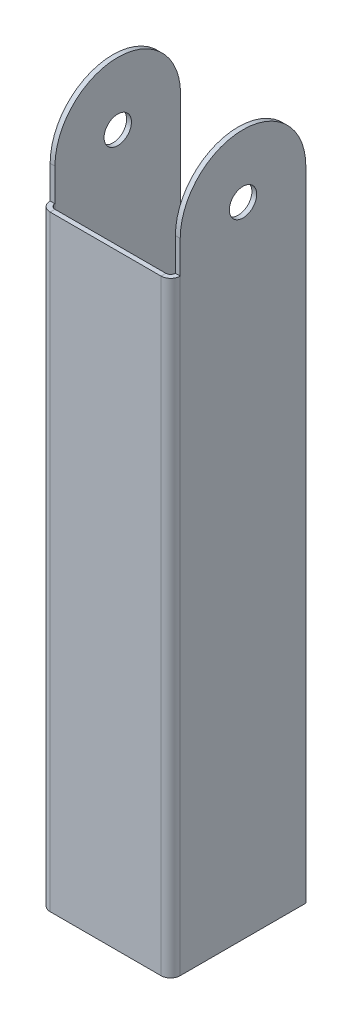
ISO-10303-21;
HEADER;
FILE_DESCRIPTION(('STEP AP214'),'2;1');
FILE_NAME('part.step','',(''),(''),'','','');
FILE_SCHEMA(('AUTOMOTIVE_DESIGN { 1 0 10303 214 1 1 1 1 }'));
ENDSEC;
DATA;
#1=APPLICATION_CONTEXT('core data for automotive mechanical design processes');
#2=APPLICATION_PROTOCOL_DEFINITION('international standard','automotive_design',2000,#1);
#3=PRODUCT_CONTEXT('',#1,'mechanical');
#4=PRODUCT('Part','Part','',(#3));
#5=PRODUCT_RELATED_PRODUCT_CATEGORY('part','',(#4));
#6=PRODUCT_DEFINITION_FORMATION('','',#4);
#7=PRODUCT_DEFINITION_CONTEXT('part definition',#1,'design');
#8=PRODUCT_DEFINITION('design','',#6,#7);
#9=PRODUCT_DEFINITION_SHAPE('','',#8);
#10=(LENGTH_UNIT() NAMED_UNIT(*) SI_UNIT(.MILLI.,.METRE.));
#11=(NAMED_UNIT(*) PLANE_ANGLE_UNIT() SI_UNIT($,.RADIAN.));
#12=(NAMED_UNIT(*) SI_UNIT($,.STERADIAN.) SOLID_ANGLE_UNIT());
#13=UNCERTAINTY_MEASURE_WITH_UNIT(LENGTH_MEASURE(1.E-05),#10,'distance_accuracy_value','');
#14=(GEOMETRIC_REPRESENTATION_CONTEXT(3) GLOBAL_UNCERTAINTY_ASSIGNED_CONTEXT((#13)) GLOBAL_UNIT_ASSIGNED_CONTEXT((#10,
#11,#12)) REPRESENTATION_CONTEXT('',''));
#15=CARTESIAN_POINT('',(0.,0.,0.));
#16=DIRECTION('',(0.,0.,1.));
#17=DIRECTION('',(1.,0.,0.));
#18=AXIS2_PLACEMENT_3D('',#15,#16,#17);
#19=CARTESIAN_POINT('',(-7.5,-46.4610389610389,-0.7366));
#20=DIRECTION('',(0.,-1.,0.));
#21=DIRECTION('',(0.,0.,-1.));
#22=AXIS2_PLACEMENT_3D('',#19,#20,#21);
#23=PLANE('',#22);
#24=DIRECTION('',(1.,0.,0.));
#25=VECTOR('',#24,1.);
#26=CARTESIAN_POINT('',(-7.5,-46.4610389610389,0.));
#27=LINE('',#26,#25);
#28=CARTESIAN_POINT('',(-8.5,-46.4610389610389,0.));
#29=VERTEX_POINT('',#28);
#30=CARTESIAN_POINT('',(8.5,-46.4610389610389,0.));
#31=VERTEX_POINT('',#30);
#32=EDGE_CURVE('E79',#29,#31,#27,.T.);
#33=ORIENTED_EDGE('',*,*,#32,.F.);
#34=DIRECTION('',(0.,0.,1.));
#35=VECTOR('',#34,1.);
#36=CARTESIAN_POINT('',(-8.5,-46.4610389610389,-0.7366));
#37=LINE('',#36,#35);
#38=CARTESIAN_POINT('',(-8.5,-46.4610389610389,-0.7366));
#39=VERTEX_POINT('',#38);
#40=EDGE_CURVE('E226',#39,#29,#37,.T.);
#41=ORIENTED_EDGE('',*,*,#40,.F.);
#42=DIRECTION('',(1.,0.,0.));
#43=VECTOR('',#42,1.);
#44=CARTESIAN_POINT('',(-7.5,-46.4610389610389,-0.7366));
#45=LINE('',#44,#43);
#46=CARTESIAN_POINT('',(8.5,-46.4610389610389,-0.736599999999997));
#47=VERTEX_POINT('',#46);
#48=EDGE_CURVE('E13',#39,#47,#45,.T.);
#49=ORIENTED_EDGE('',*,*,#48,.T.);
#50=DIRECTION('',(0.,0.,1.));
#51=VECTOR('',#50,1.);
#52=CARTESIAN_POINT('',(8.5,-46.4610389610389,-0.736599999999997));
#53=LINE('',#52,#51);
#54=EDGE_CURVE('E256',#47,#31,#53,.T.);
#55=ORIENTED_EDGE('',*,*,#54,.T.);
#56=EDGE_LOOP('',(#33,#41,#49,#55));
#57=FACE_BOUND('',#56,.T.);
#58=ADVANCED_FACE('F75',(#57),#23,.T.);
#59=CARTESIAN_POINT('',(-7.5,46.4610389610389,-0.7366));
#60=DIRECTION('',(0.,1.,0.));
#61=DIRECTION('',(0.,0.,1.));
#62=AXIS2_PLACEMENT_3D('',#59,#60,#61);
#63=PLANE('',#62);
#64=DIRECTION('',(-1.,0.,0.));
#65=VECTOR('',#64,1.);
#66=CARTESIAN_POINT('',(-7.5,46.4610389610389,0.));
#67=LINE('',#66,#65);
#68=CARTESIAN_POINT('',(8.5,46.4610389610389,0.));
#69=VERTEX_POINT('',#68);
#70=CARTESIAN_POINT('',(-8.5,46.4610389610389,0.));
#71=VERTEX_POINT('',#70);
#72=EDGE_CURVE('E268',#69,#71,#67,.T.);
#73=ORIENTED_EDGE('',*,*,#72,.F.);
#74=DIRECTION('',(0.,0.,1.));
#75=VECTOR('',#74,1.);
#76=CARTESIAN_POINT('',(8.5,46.4610389610389,-0.736599999999997));
#77=LINE('',#76,#75);
#78=CARTESIAN_POINT('',(8.5,46.4610389610389,-0.736599999999997));
#79=VERTEX_POINT('',#78);
#80=EDGE_CURVE('E266',#79,#69,#77,.T.);
#81=ORIENTED_EDGE('',*,*,#80,.F.);
#82=DIRECTION('',(-1.,0.,0.));
#83=VECTOR('',#82,1.);
#84=CARTESIAN_POINT('',(-7.5,46.4610389610389,-0.7366));
#85=LINE('',#84,#83);
#86=CARTESIAN_POINT('',(-8.5,46.4610389610389,-0.7366));
#87=VERTEX_POINT('',#86);
#88=EDGE_CURVE('E84',#79,#87,#85,.T.);
#89=ORIENTED_EDGE('',*,*,#88,.T.);
#90=DIRECTION('',(0.,0.,1.));
#91=VECTOR('',#90,1.);
#92=CARTESIAN_POINT('',(-8.5,46.4610389610389,-0.7366));
#93=LINE('',#92,#91);
#94=EDGE_CURVE('E216',#87,#71,#93,.T.);
#95=ORIENTED_EDGE('',*,*,#94,.T.);
#96=EDGE_LOOP('',(#73,#81,#89,#95));
#97=FACE_BOUND('',#96,.T.);
#98=ADVANCED_FACE('F77',(#97),#63,.T.);
#99=CARTESIAN_POINT('',(0.,0.,-0.7366));
#100=DIRECTION('',(0.,0.,-1.));
#101=DIRECTION('',(-1.,0.,0.));
#102=AXIS2_PLACEMENT_3D('',#99,#100,#101);
#103=PLANE('',#102);
#104=ORIENTED_EDGE('',*,*,#88,.F.);
#105=DIRECTION('',(0.,-1.,0.));
#106=VECTOR('',#105,1.);
#107=CARTESIAN_POINT('',(8.5,-46.4610389610389,-0.736599999999997));
#108=LINE('',#107,#106);
#109=EDGE_CURVE('E262',#47,#79,#108,.F.);
#110=ORIENTED_EDGE('',*,*,#109,.F.);
#111=ORIENTED_EDGE('',*,*,#48,.F.);
#112=DIRECTION('',(0.,1.,0.));
#113=VECTOR('',#112,1.);
#114=CARTESIAN_POINT('',(-8.5,46.4610389610389,-0.7366));
#115=LINE('',#114,#113);
#116=EDGE_CURVE('E217',#87,#39,#115,.F.);
#117=ORIENTED_EDGE('',*,*,#116,.F.);
#118=EDGE_LOOP('',(#104,#110,#111,#117));
#119=FACE_BOUND('',#118,.T.);
#120=ADVANCED_FACE('F389',(#119),#103,.T.);
#121=CARTESIAN_POINT('',(0.,0.,0.));
#122=DIRECTION('',(0.,0.,-1.));
#123=DIRECTION('',(-1.,0.,0.));
#124=AXIS2_PLACEMENT_3D('',#121,#122,#123);
#125=PLANE('',#124);
#126=ORIENTED_EDGE('',*,*,#32,.T.);
#127=DIRECTION('',(0.,-1.,0.));
#128=VECTOR('',#127,1.);
#129=CARTESIAN_POINT('',(8.5,-46.4610389610389,0.));
#130=LINE('',#129,#128);
#131=EDGE_CURVE('E251',#31,#69,#130,.F.);
#132=ORIENTED_EDGE('',*,*,#131,.T.);
#133=ORIENTED_EDGE('',*,*,#72,.T.);
#134=DIRECTION('',(0.,1.,0.));
#135=VECTOR('',#134,1.);
#136=CARTESIAN_POINT('',(-8.5,46.4610389610389,0.));
#137=LINE('',#136,#135);
#138=EDGE_CURVE('E278',#71,#29,#137,.F.);
#139=ORIENTED_EDGE('',*,*,#138,.T.);
#140=EDGE_LOOP('',(#126,#132,#133,#139));
#141=FACE_BOUND('',#140,.T.);
#142=ADVANCED_FACE('F277',(#141),#125,.F.);
#143=CARTESIAN_POINT('',(8.5,46.4610389610389,-1.4732));
#144=DIRECTION('',(0.,1.,0.));
#145=DIRECTION('',(0.,0.,1.));
#146=AXIS2_PLACEMENT_3D('',#143,#144,#145);
#147=PLANE('',#146);
#148=DIRECTION('',(-1.,0.,0.));
#149=VECTOR('',#148,1.);
#150=CARTESIAN_POINT('',(9.9732,46.4610389610389,-1.47319999999999));
#151=LINE('',#150,#149);
#152=CARTESIAN_POINT('',(9.2366,46.4610389610389,-1.47319999999999));
#153=VERTEX_POINT('',#152);
#154=CARTESIAN_POINT('',(9.9732,46.4610389610389,-1.47319999999999));
#155=VERTEX_POINT('',#154);
#156=EDGE_CURVE('E228',#153,#155,#151,.F.);
#157=ORIENTED_EDGE('',*,*,#156,.F.);
#158=CARTESIAN_POINT('',(8.5,46.4610389610389,-1.4732));
#159=DIRECTION('',(0.,-1.,0.));
#160=DIRECTION('',(0.,0.,-1.));
#161=AXIS2_PLACEMENT_3D('',#158,#159,#160);
#162=CIRCLE('',#161,0.7366);
#163=EDGE_CURVE('E259',#79,#153,#162,.F.);
#164=ORIENTED_EDGE('',*,*,#163,.F.);
#165=ORIENTED_EDGE('',*,*,#80,.T.);
#166=CARTESIAN_POINT('',(8.5,46.4610389610389,-1.4732));
#167=DIRECTION('',(0.,-1.,0.));
#168=DIRECTION('',(0.,0.,-1.));
#169=AXIS2_PLACEMENT_3D('',#166,#167,#168);
#170=CIRCLE('',#169,1.4732);
#171=EDGE_CURVE('E92',#69,#155,#170,.F.);
#172=ORIENTED_EDGE('',*,*,#171,.T.);
#173=EDGE_LOOP('',(#157,#164,#165,#172));
#174=FACE_BOUND('',#173,.T.);
#175=ADVANCED_FACE('F394',(#174),#147,.T.);
#176=CARTESIAN_POINT('',(8.5,-46.4610389610389,-1.4732));
#177=DIRECTION('',(0.,1.,0.));
#178=DIRECTION('',(0.,0.,1.));
#179=AXIS2_PLACEMENT_3D('',#176,#177,#178);
#180=PLANE('',#179);
#181=CARTESIAN_POINT('',(8.5,-46.4610389610389,-1.4732));
#182=DIRECTION('',(0.,-1.,0.));
#183=DIRECTION('',(0.,0.,-1.));
#184=AXIS2_PLACEMENT_3D('',#181,#182,#183);
#185=CIRCLE('',#184,0.7366);
#186=CARTESIAN_POINT('',(9.2366,-46.4610389610389,-1.47319999999999));
#187=VERTEX_POINT('',#186);
#188=EDGE_CURVE('E233',#187,#47,#185,.T.);
#189=ORIENTED_EDGE('',*,*,#188,.F.);
#190=DIRECTION('',(-1.,0.,0.));
#191=VECTOR('',#190,1.);
#192=CARTESIAN_POINT('',(9.2366,-46.4610389610389,-1.47319999999999));
#193=LINE('',#192,#191);
#194=CARTESIAN_POINT('',(9.9732,-46.4610389610389,-1.47319999999999));
#195=VERTEX_POINT('',#194);
#196=EDGE_CURVE('E244',#187,#195,#193,.F.);
#197=ORIENTED_EDGE('',*,*,#196,.T.);
#198=CARTESIAN_POINT('',(8.5,-46.4610389610389,-1.4732));
#199=DIRECTION('',(0.,-1.,0.));
#200=DIRECTION('',(0.,0.,-1.));
#201=AXIS2_PLACEMENT_3D('',#198,#199,#200);
#202=CIRCLE('',#201,1.4732);
#203=EDGE_CURVE('E254',#195,#31,#202,.T.);
#204=ORIENTED_EDGE('',*,*,#203,.T.);
#205=ORIENTED_EDGE('',*,*,#54,.F.);
#206=EDGE_LOOP('',(#189,#197,#204,#205));
#207=FACE_BOUND('',#206,.T.);
#208=ADVANCED_FACE('F285',(#207),#180,.F.);
#209=CARTESIAN_POINT('',(8.5,-46.4610389610389,-1.4732));
#210=DIRECTION('',(0.,-1.,0.));
#211=DIRECTION('',(1.,0.,0.));
#212=AXIS2_PLACEMENT_3D('',#209,#210,#211);
#213=CYLINDRICAL_SURFACE('',#212,1.4732);
#214=ORIENTED_EDGE('',*,*,#131,.F.);
#215=ORIENTED_EDGE('',*,*,#203,.F.);
#216=DIRECTION('',(0.,-1.,0.));
#217=VECTOR('',#216,1.);
#218=CARTESIAN_POINT('',(9.9732,46.4610389610389,-1.47319999999999));
#219=LINE('',#218,#217);
#220=EDGE_CURVE('E242',#195,#155,#219,.F.);
#221=ORIENTED_EDGE('',*,*,#220,.T.);
#222=ORIENTED_EDGE('',*,*,#171,.F.);
#223=EDGE_LOOP('',(#214,#215,#221,#222));
#224=FACE_BOUND('',#223,.T.);
#225=ADVANCED_FACE('F400',(#224),#213,.T.);
#226=CARTESIAN_POINT('',(8.5,-46.4610389610389,-1.4732));
#227=DIRECTION('',(0.,-1.,0.));
#228=DIRECTION('',(1.,0.,0.));
#229=AXIS2_PLACEMENT_3D('',#226,#227,#228);
#230=CYLINDRICAL_SURFACE('',#229,0.7366);
#231=ORIENTED_EDGE('',*,*,#109,.T.);
#232=ORIENTED_EDGE('',*,*,#163,.T.);
#233=DIRECTION('',(0.,-1.,0.));
#234=VECTOR('',#233,1.);
#235=CARTESIAN_POINT('',(9.2366,46.4610389610389,-1.4732));
#236=LINE('',#235,#234);
#237=EDGE_CURVE('E247',#153,#187,#236,.T.);
#238=ORIENTED_EDGE('',*,*,#237,.T.);
#239=ORIENTED_EDGE('',*,*,#188,.T.);
#240=EDGE_LOOP('',(#231,#232,#238,#239));
#241=FACE_BOUND('',#240,.T.);
#242=ADVANCED_FACE('F288',(#241),#230,.F.);
#243=CARTESIAN_POINT('',(9.97320000000007,-46.4610389610389,-20.7366));
#244=DIRECTION('',(0.,1.,0.));
#245=DIRECTION('',(0.,0.,1.));
#246=AXIS2_PLACEMENT_3D('',#243,#244,#245);
#247=PLANE('',#246);
#248=ORIENTED_EDGE('',*,*,#196,.F.);
#249=DIRECTION('',(0.,0.,1.));
#250=VECTOR('',#249,1.);
#251=CARTESIAN_POINT('',(9.23660000000007,-46.4610389610389,-20.7366));
#252=LINE('',#251,#250);
#253=CARTESIAN_POINT('',(9.23660000000007,-46.4610389610389,-20.7366));
#254=VERTEX_POINT('',#253);
#255=EDGE_CURVE('E240',#187,#254,#252,.F.);
#256=ORIENTED_EDGE('',*,*,#255,.T.);
#257=DIRECTION('',(-1.,0.,0.));
#258=VECTOR('',#257,1.);
#259=CARTESIAN_POINT('',(9.97320000000007,-46.4610389610389,-20.7366));
#260=LINE('',#259,#258);
#261=CARTESIAN_POINT('',(9.97320000000007,-46.4610389610389,-20.7366));
#262=VERTEX_POINT('',#261);
#263=EDGE_CURVE('E230',#262,#254,#260,.T.);
#264=ORIENTED_EDGE('',*,*,#263,.F.);
#265=DIRECTION('',(0.,0.,-1.));
#266=VECTOR('',#265,1.);
#267=CARTESIAN_POINT('',(9.97319999999999,-46.4610389610389,0.));
#268=LINE('',#267,#266);
#269=EDGE_CURVE('E236',#195,#262,#268,.T.);
#270=ORIENTED_EDGE('',*,*,#269,.F.);
#271=EDGE_LOOP('',(#248,#256,#264,#270));
#272=FACE_BOUND('',#271,.T.);
#273=ADVANCED_FACE('F372',(#272),#247,.F.);
#274=CARTESIAN_POINT('',(9.97319999999999,0.,0.));
#275=DIRECTION('',(-1.,0.,0.));
#276=DIRECTION('',(0.,0.,1.));
#277=AXIS2_PLACEMENT_3D('',#274,#275,#276);
#278=PLANE('',#277);
#279=ORIENTED_EDGE('',*,*,#220,.F.);
#280=ORIENTED_EDGE('',*,*,#269,.T.);
#281=DIRECTION('',(0.,1.,0.));
#282=VECTOR('',#281,1.);
#283=CARTESIAN_POINT('',(9.97320000000007,0.,-20.7366));
#284=LINE('',#283,#282);
#285=CARTESIAN_POINT('',(9.97320000000007,51.4610389610389,-20.7366));
#286=VERTEX_POINT('',#285);
#287=EDGE_CURVE('E234',#262,#286,#284,.T.);
#288=ORIENTED_EDGE('',*,*,#287,.T.);
#289=CARTESIAN_POINT('',(9.97320000000003,51.4610389610389,-11.1049));
#290=DIRECTION('',(1.,0.,0.));
#291=DIRECTION('',(0.,0.,1.));
#292=AXIS2_PLACEMENT_3D('',#289,#290,#291);
#293=CIRCLE('',#292,9.6317);
#294=CARTESIAN_POINT('',(9.9732,51.4610389610389,-1.47319999999999));
#295=VERTEX_POINT('',#294);
#296=EDGE_CURVE('E315',#286,#295,#293,.T.);
#297=ORIENTED_EDGE('',*,*,#296,.T.);
#298=DIRECTION('',(0.,-1.,0.));
#299=VECTOR('',#298,1.);
#300=CARTESIAN_POINT('',(9.9732,46.4610389610389,-1.47319999999999));
#301=LINE('',#300,#299);
#302=EDGE_CURVE('E311',#295,#155,#301,.T.);
#303=ORIENTED_EDGE('',*,*,#302,.T.);
#304=EDGE_LOOP('',(#279,#280,#288,#297,#303));
#305=FACE_BOUND('',#304,.T.);
#306=CARTESIAN_POINT('',(9.97320000000003,51.4610389610389,-11.1049));
#307=DIRECTION('',(1.,0.,0.));
#308=DIRECTION('',(0.,0.,-1.));
#309=AXIS2_PLACEMENT_3D('',#306,#307,#308);
#310=CIRCLE('',#309,2.1);
#311=CARTESIAN_POINT('',(9.97320000000004,51.4610389610389,-13.2049));
#312=VERTEX_POINT('',#311);
#313=EDGE_CURVE('E353',#312,#312,#310,.T.);
#314=ORIENTED_EDGE('',*,*,#313,.F.);
#315=EDGE_LOOP('',(#314));
#316=FACE_BOUND('',#315,.T.);
#317=ADVANCED_FACE('F370',(#305,#316),#278,.F.);
#318=CARTESIAN_POINT('',(9.23659999999999,0.,0.));
#319=DIRECTION('',(-1.,0.,0.));
#320=DIRECTION('',(0.,0.,1.));
#321=AXIS2_PLACEMENT_3D('',#318,#319,#320);
#322=PLANE('',#321);
#323=ORIENTED_EDGE('',*,*,#255,.F.);
#324=ORIENTED_EDGE('',*,*,#237,.F.);
#325=DIRECTION('',(0.,-1.,0.));
#326=VECTOR('',#325,1.);
#327=CARTESIAN_POINT('',(9.2366,46.4610389610389,-1.47319999999999));
#328=LINE('',#327,#326);
#329=CARTESIAN_POINT('',(9.2366,51.4610389610389,-1.47319999999999));
#330=VERTEX_POINT('',#329);
#331=EDGE_CURVE('E298',#330,#153,#328,.T.);
#332=ORIENTED_EDGE('',*,*,#331,.F.);
#333=CARTESIAN_POINT('',(9.23660000000003,51.4610389610389,-11.1049));
#334=DIRECTION('',(1.,0.,0.));
#335=DIRECTION('',(0.,0.,1.));
#336=AXIS2_PLACEMENT_3D('',#333,#334,#335);
#337=CIRCLE('',#336,9.6317);
#338=CARTESIAN_POINT('',(9.23660000000007,51.4610389610389,-20.7366));
#339=VERTEX_POINT('',#338);
#340=EDGE_CURVE('E307',#339,#330,#337,.T.);
#341=ORIENTED_EDGE('',*,*,#340,.F.);
#342=DIRECTION('',(0.,-1.,0.));
#343=VECTOR('',#342,1.);
#344=CARTESIAN_POINT('',(9.23660000000007,46.4610389610389,-20.7366));
#345=LINE('',#344,#343);
#346=EDGE_CURVE('E238',#254,#339,#345,.F.);
#347=ORIENTED_EDGE('',*,*,#346,.F.);
#348=EDGE_LOOP('',(#323,#324,#332,#341,#347));
#349=FACE_BOUND('',#348,.T.);
#350=CARTESIAN_POINT('',(9.23660000000003,51.4610389610389,-11.1049));
#351=DIRECTION('',(1.,0.,0.));
#352=DIRECTION('',(0.,0.,-1.));
#353=AXIS2_PLACEMENT_3D('',#350,#351,#352);
#354=CIRCLE('',#353,2.1);
#355=CARTESIAN_POINT('',(9.23660000000004,51.4610389610389,-13.2049));
#356=VERTEX_POINT('',#355);
#357=EDGE_CURVE('E318',#356,#356,#354,.T.);
#358=ORIENTED_EDGE('',*,*,#357,.T.);
#359=EDGE_LOOP('',(#358));
#360=FACE_BOUND('',#359,.T.);
#361=ADVANCED_FACE('F295',(#349,#360),#322,.T.);
#362=CARTESIAN_POINT('',(9.97320000000007,46.4610389610389,-20.7366));
#363=DIRECTION('',(0.,0.,1.));
#364=DIRECTION('',(1.,0.,0.));
#365=AXIS2_PLACEMENT_3D('',#362,#363,#364);
#366=PLANE('',#365);
#367=ORIENTED_EDGE('',*,*,#346,.T.);
#368=DIRECTION('',(1.,0.,0.));
#369=VECTOR('',#368,1.);
#370=CARTESIAN_POINT('',(9.23660000000007,51.4610389610389,-20.7366));
#371=LINE('',#370,#369);
#372=EDGE_CURVE('E306',#339,#286,#371,.T.);
#373=ORIENTED_EDGE('',*,*,#372,.T.);
#374=ORIENTED_EDGE('',*,*,#287,.F.);
#375=ORIENTED_EDGE('',*,*,#263,.T.);
#376=EDGE_LOOP('',(#367,#373,#374,#375));
#377=FACE_BOUND('',#376,.T.);
#378=ADVANCED_FACE('F379',(#377),#366,.F.);
#379=CARTESIAN_POINT('',(-8.5,-46.4610389610389,-1.4732));
#380=DIRECTION('',(0.,-1.,0.));
#381=DIRECTION('',(0.,0.,-1.));
#382=AXIS2_PLACEMENT_3D('',#379,#380,#381);
#383=PLANE('',#382);
#384=DIRECTION('',(1.,0.,0.));
#385=VECTOR('',#384,1.);
#386=CARTESIAN_POINT('',(-9.9732,-46.4610389610389,-1.47319999999999));
#387=LINE('',#386,#385);
#388=CARTESIAN_POINT('',(-9.2366,-46.4610389610389,-1.4732));
#389=VERTEX_POINT('',#388);
#390=CARTESIAN_POINT('',(-9.9732,-46.4610389610389,-1.4732));
#391=VERTEX_POINT('',#390);
#392=EDGE_CURVE('E212',#389,#391,#387,.F.);
#393=ORIENTED_EDGE('',*,*,#392,.F.);
#394=CARTESIAN_POINT('',(-8.5,-46.4610389610389,-1.4732));
#395=DIRECTION('',(0.,1.,0.));
#396=DIRECTION('',(0.,0.,1.));
#397=AXIS2_PLACEMENT_3D('',#394,#395,#396);
#398=CIRCLE('',#397,0.7366);
#399=EDGE_CURVE('E211',#39,#389,#398,.F.);
#400=ORIENTED_EDGE('',*,*,#399,.F.);
#401=ORIENTED_EDGE('',*,*,#40,.T.);
#402=CARTESIAN_POINT('',(-8.5,-46.4610389610389,-1.4732));
#403=DIRECTION('',(0.,1.,0.));
#404=DIRECTION('',(0.,0.,1.));
#405=AXIS2_PLACEMENT_3D('',#402,#403,#404);
#406=CIRCLE('',#405,1.4732);
#407=EDGE_CURVE('E100',#29,#391,#406,.F.);
#408=ORIENTED_EDGE('',*,*,#407,.T.);
#409=EDGE_LOOP('',(#393,#400,#401,#408));
#410=FACE_BOUND('',#409,.T.);
#411=ADVANCED_FACE('F338',(#410),#383,.T.);
#412=CARTESIAN_POINT('',(-8.5,46.4610389610389,-1.4732));
#413=DIRECTION('',(0.,-1.,0.));
#414=DIRECTION('',(0.,0.,-1.));
#415=AXIS2_PLACEMENT_3D('',#412,#413,#414);
#416=PLANE('',#415);
#417=CARTESIAN_POINT('',(-8.5,46.4610389610389,-1.4732));
#418=DIRECTION('',(0.,1.,0.));
#419=DIRECTION('',(0.,0.,1.));
#420=AXIS2_PLACEMENT_3D('',#417,#418,#419);
#421=CIRCLE('',#420,0.7366);
#422=CARTESIAN_POINT('',(-9.2366,46.4610389610389,-1.4732));
#423=VERTEX_POINT('',#422);
#424=EDGE_CURVE('E208',#423,#87,#421,.T.);
#425=ORIENTED_EDGE('',*,*,#424,.F.);
#426=DIRECTION('',(1.,0.,0.));
#427=VECTOR('',#426,1.);
#428=CARTESIAN_POINT('',(-9.2366,46.4610389610389,-1.4732));
#429=LINE('',#428,#427);
#430=CARTESIAN_POINT('',(-9.9732,46.4610389610389,-1.4732));
#431=VERTEX_POINT('',#430);
#432=EDGE_CURVE('E178',#423,#431,#429,.F.);
#433=ORIENTED_EDGE('',*,*,#432,.T.);
#434=CARTESIAN_POINT('',(-8.5,46.4610389610389,-1.4732));
#435=DIRECTION('',(0.,1.,0.));
#436=DIRECTION('',(0.,0.,1.));
#437=AXIS2_PLACEMENT_3D('',#434,#435,#436);
#438=CIRCLE('',#437,1.4732);
#439=EDGE_CURVE('E333',#431,#71,#438,.T.);
#440=ORIENTED_EDGE('',*,*,#439,.T.);
#441=ORIENTED_EDGE('',*,*,#94,.F.);
#442=EDGE_LOOP('',(#425,#433,#440,#441));
#443=FACE_BOUND('',#442,.T.);
#444=ADVANCED_FACE('F214',(#443),#416,.F.);
#445=CARTESIAN_POINT('',(-8.5,46.4610389610389,-1.4732));
#446=DIRECTION('',(0.,1.,0.));
#447=DIRECTION('',(-1.,0.,0.));
#448=AXIS2_PLACEMENT_3D('',#445,#446,#447);
#449=CYLINDRICAL_SURFACE('',#448,1.4732);
#450=ORIENTED_EDGE('',*,*,#138,.F.);
#451=ORIENTED_EDGE('',*,*,#439,.F.);
#452=DIRECTION('',(0.,1.,0.));
#453=VECTOR('',#452,1.);
#454=CARTESIAN_POINT('',(-9.9732,-46.4610389610389,-1.47319999999999));
#455=LINE('',#454,#453);
#456=EDGE_CURVE('E189',#431,#391,#455,.F.);
#457=ORIENTED_EDGE('',*,*,#456,.T.);
#458=ORIENTED_EDGE('',*,*,#407,.F.);
#459=EDGE_LOOP('',(#450,#451,#457,#458));
#460=FACE_BOUND('',#459,.T.);
#461=ADVANCED_FACE('F335',(#460),#449,.T.);
#462=CARTESIAN_POINT('',(-8.5,46.4610389610389,-1.4732));
#463=DIRECTION('',(0.,1.,0.));
#464=DIRECTION('',(-1.,0.,0.));
#465=AXIS2_PLACEMENT_3D('',#462,#463,#464);
#466=CYLINDRICAL_SURFACE('',#465,0.7366);
#467=ORIENTED_EDGE('',*,*,#116,.T.);
#468=ORIENTED_EDGE('',*,*,#399,.T.);
#469=DIRECTION('',(0.,1.,0.));
#470=VECTOR('',#469,1.);
#471=CARTESIAN_POINT('',(-9.2366,-46.4610389610389,-1.4732));
#472=LINE('',#471,#470);
#473=EDGE_CURVE('E190',#389,#423,#472,.T.);
#474=ORIENTED_EDGE('',*,*,#473,.T.);
#475=ORIENTED_EDGE('',*,*,#424,.T.);
#476=EDGE_LOOP('',(#467,#468,#474,#475));
#477=FACE_BOUND('',#476,.T.);
#478=ADVANCED_FACE('F207',(#477),#466,.F.);
#479=CARTESIAN_POINT('',(-9.9732,-46.4610389610389,-0.736599999999997));
#480=DIRECTION('',(0.,1.,0.));
#481=DIRECTION('',(0.,0.,1.));
#482=AXIS2_PLACEMENT_3D('',#479,#480,#481);
#483=PLANE('',#482);
#484=ORIENTED_EDGE('',*,*,#392,.T.);
#485=DIRECTION('',(0.,0.,1.));
#486=VECTOR('',#485,1.);
#487=CARTESIAN_POINT('',(-9.97319999999999,-46.4610389610389,0.));
#488=LINE('',#487,#486);
#489=CARTESIAN_POINT('',(-9.97320000000007,-46.4610389610389,-20.7366));
#490=VERTEX_POINT('',#489);
#491=EDGE_CURVE('E222',#490,#391,#488,.T.);
#492=ORIENTED_EDGE('',*,*,#491,.F.);
#493=DIRECTION('',(1.,0.,0.));
#494=VECTOR('',#493,1.);
#495=CARTESIAN_POINT('',(-9.97320000000007,-46.4610389610389,-20.7366));
#496=LINE('',#495,#494);
#497=CARTESIAN_POINT('',(-9.23660000000007,-46.4610389610389,-20.7366));
#498=VERTEX_POINT('',#497);
#499=EDGE_CURVE('E218',#490,#498,#496,.T.);
#500=ORIENTED_EDGE('',*,*,#499,.T.);
#501=DIRECTION('',(0.,0.,-1.));
#502=VECTOR('',#501,1.);
#503=CARTESIAN_POINT('',(-9.2366,-46.4610389610389,-0.7366));
#504=LINE('',#503,#502);
#505=EDGE_CURVE('E325',#498,#389,#504,.F.);
#506=ORIENTED_EDGE('',*,*,#505,.T.);
#507=EDGE_LOOP('',(#484,#492,#500,#506));
#508=FACE_BOUND('',#507,.T.);
#509=ADVANCED_FACE('F341',(#508),#483,.F.);
#510=CARTESIAN_POINT('',(-9.97319999999999,0.,0.));
#511=DIRECTION('',(1.,0.,0.));
#512=DIRECTION('',(0.,0.,-1.));
#513=AXIS2_PLACEMENT_3D('',#510,#511,#512);
#514=PLANE('',#513);
#515=ORIENTED_EDGE('',*,*,#456,.F.);
#516=DIRECTION('',(0.,1.,0.));
#517=VECTOR('',#516,1.);
#518=CARTESIAN_POINT('',(-9.9732,46.4610389610389,-1.4732));
#519=LINE('',#518,#517);
#520=CARTESIAN_POINT('',(-9.9732,51.4610389610389,-1.4732));
#521=VERTEX_POINT('',#520);
#522=EDGE_CURVE('E183',#431,#521,#519,.T.);
#523=ORIENTED_EDGE('',*,*,#522,.T.);
#524=CARTESIAN_POINT('',(-9.97320000000003,51.4610389610389,-11.1049));
#525=DIRECTION('',(-1.,0.,0.));
#526=DIRECTION('',(0.,0.,-1.));
#527=AXIS2_PLACEMENT_3D('',#524,#525,#526);
#528=CIRCLE('',#527,9.6317);
#529=CARTESIAN_POINT('',(-9.97320000000007,51.4610389610389,-20.7366));
#530=VERTEX_POINT('',#529);
#531=EDGE_CURVE('E202',#521,#530,#528,.T.);
#532=ORIENTED_EDGE('',*,*,#531,.T.);
#533=DIRECTION('',(0.,-1.,0.));
#534=VECTOR('',#533,1.);
#535=CARTESIAN_POINT('',(-9.97320000000007,0.,-20.7366));
#536=LINE('',#535,#534);
#537=EDGE_CURVE('E323',#530,#490,#536,.T.);
#538=ORIENTED_EDGE('',*,*,#537,.T.);
#539=ORIENTED_EDGE('',*,*,#491,.T.);
#540=EDGE_LOOP('',(#515,#523,#532,#538,#539));
#541=FACE_BOUND('',#540,.T.);
#542=CARTESIAN_POINT('',(-9.97320000000003,51.4610389610389,-11.1049));
#543=DIRECTION('',(-1.,0.,0.));
#544=DIRECTION('',(0.,0.,1.));
#545=AXIS2_PLACEMENT_3D('',#542,#543,#544);
#546=CIRCLE('',#545,2.1);
#547=CARTESIAN_POINT('',(-9.97320000000003,51.4610389610389,-9.0049));
#548=VERTEX_POINT('',#547);
#549=EDGE_CURVE('E689',#548,#548,#546,.T.);
#550=ORIENTED_EDGE('',*,*,#549,.F.);
#551=EDGE_LOOP('',(#550));
#552=FACE_BOUND('',#551,.T.);
#553=ADVANCED_FACE('F342',(#541,#552),#514,.F.);
#554=CARTESIAN_POINT('',(-9.23659999999999,0.,0.));
#555=DIRECTION('',(1.,0.,0.));
#556=DIRECTION('',(0.,0.,-1.));
#557=AXIS2_PLACEMENT_3D('',#554,#555,#556);
#558=PLANE('',#557);
#559=DIRECTION('',(0.,1.,0.));
#560=VECTOR('',#559,1.);
#561=CARTESIAN_POINT('',(-9.23660000000007,-46.4610389610389,-20.7366));
#562=LINE('',#561,#560);
#563=CARTESIAN_POINT('',(-9.23660000000007,51.4610389610389,-20.7366));
#564=VERTEX_POINT('',#563);
#565=EDGE_CURVE('E327',#564,#498,#562,.F.);
#566=ORIENTED_EDGE('',*,*,#565,.F.);
#567=CARTESIAN_POINT('',(-9.23660000000003,51.4610389610389,-11.1049));
#568=DIRECTION('',(-1.,0.,0.));
#569=DIRECTION('',(0.,0.,-1.));
#570=AXIS2_PLACEMENT_3D('',#567,#568,#569);
#571=CIRCLE('',#570,9.6317);
#572=CARTESIAN_POINT('',(-9.2366,51.4610389610389,-1.4732));
#573=VERTEX_POINT('',#572);
#574=EDGE_CURVE('E201',#573,#564,#571,.T.);
#575=ORIENTED_EDGE('',*,*,#574,.F.);
#576=DIRECTION('',(0.,1.,0.));
#577=VECTOR('',#576,1.);
#578=CARTESIAN_POINT('',(-9.2366,46.4610389610389,-1.4732));
#579=LINE('',#578,#577);
#580=EDGE_CURVE('E181',#423,#573,#579,.T.);
#581=ORIENTED_EDGE('',*,*,#580,.F.);
#582=ORIENTED_EDGE('',*,*,#473,.F.);
#583=ORIENTED_EDGE('',*,*,#505,.F.);
#584=EDGE_LOOP('',(#566,#575,#581,#582,#583));
#585=FACE_BOUND('',#584,.T.);
#586=CARTESIAN_POINT('',(-9.23660000000003,51.4610389610389,-11.1049));
#587=DIRECTION('',(-1.,0.,0.));
#588=DIRECTION('',(0.,0.,1.));
#589=AXIS2_PLACEMENT_3D('',#586,#587,#588);
#590=CIRCLE('',#589,2.1);
#591=CARTESIAN_POINT('',(-9.23660000000003,51.4610389610389,-9.00490000000001));
#592=VERTEX_POINT('',#591);
#593=EDGE_CURVE('E362',#592,#592,#590,.T.);
#594=ORIENTED_EDGE('',*,*,#593,.T.);
#595=EDGE_LOOP('',(#594));
#596=FACE_BOUND('',#595,.T.);
#597=ADVANCED_FACE('F196',(#585,#596),#558,.T.);
#598=CARTESIAN_POINT('',(-9.97320000000007,-46.4610389610389,-20.7366));
#599=DIRECTION('',(0.,0.,1.));
#600=DIRECTION('',(1.,0.,0.));
#601=AXIS2_PLACEMENT_3D('',#598,#599,#600);
#602=PLANE('',#601);
#603=ORIENTED_EDGE('',*,*,#565,.T.);
#604=ORIENTED_EDGE('',*,*,#499,.F.);
#605=ORIENTED_EDGE('',*,*,#537,.F.);
#606=DIRECTION('',(-1.,0.,0.));
#607=VECTOR('',#606,1.);
#608=CARTESIAN_POINT('',(-9.23660000000007,51.4610389610389,-20.7366));
#609=LINE('',#608,#607);
#610=EDGE_CURVE('E351',#564,#530,#609,.T.);
#611=ORIENTED_EDGE('',*,*,#610,.F.);
#612=EDGE_LOOP('',(#603,#604,#605,#611));
#613=FACE_BOUND('',#612,.T.);
#614=ADVANCED_FACE('F350',(#613),#602,.F.);
#615=CARTESIAN_POINT('',(9.2366,46.4610389610389,-1.47319999999999));
#616=DIRECTION('',(0.,0.,1.));
#617=DIRECTION('',(1.,0.,0.));
#618=AXIS2_PLACEMENT_3D('',#615,#616,#617);
#619=PLANE('',#618);
#620=ORIENTED_EDGE('',*,*,#302,.F.);
#621=DIRECTION('',(1.,0.,0.));
#622=VECTOR('',#621,1.);
#623=CARTESIAN_POINT('',(9.2366,51.4610389610389,-1.47319999999999));
#624=LINE('',#623,#622);
#625=EDGE_CURVE('E304',#330,#295,#624,.T.);
#626=ORIENTED_EDGE('',*,*,#625,.F.);
#627=ORIENTED_EDGE('',*,*,#331,.T.);
#628=ORIENTED_EDGE('',*,*,#156,.T.);
#629=EDGE_LOOP('',(#620,#626,#627,#628));
#630=FACE_BOUND('',#629,.T.);
#631=ADVANCED_FACE('F302',(#630),#619,.T.);
#632=CARTESIAN_POINT('',(9.23660000000003,51.4610389610389,-11.1049));
#633=DIRECTION('',(1.,0.,0.));
#634=DIRECTION('',(0.,0.,-1.));
#635=AXIS2_PLACEMENT_3D('',#632,#633,#634);
#636=CYLINDRICAL_SURFACE('',#635,9.6317);
#637=ORIENTED_EDGE('',*,*,#296,.F.);
#638=ORIENTED_EDGE('',*,*,#372,.F.);
#639=ORIENTED_EDGE('',*,*,#340,.T.);
#640=ORIENTED_EDGE('',*,*,#625,.T.);
#641=EDGE_LOOP('',(#637,#638,#639,#640));
#642=FACE_BOUND('',#641,.T.);
#643=ADVANCED_FACE('F419',(#642),#636,.T.);
#644=CARTESIAN_POINT('',(9.23660000000003,51.4610389610389,-11.1049));
#645=DIRECTION('',(1.,0.,0.));
#646=DIRECTION('',(0.,0.,-1.));
#647=AXIS2_PLACEMENT_3D('',#644,#645,#646);
#648=CYLINDRICAL_SURFACE('',#647,2.1);
#649=ORIENTED_EDGE('',*,*,#357,.F.);
#650=EDGE_LOOP('',(#649));
#651=FACE_BOUND('',#650,.T.);
#652=ORIENTED_EDGE('',*,*,#313,.T.);
#653=EDGE_LOOP('',(#652));
#654=FACE_BOUND('',#653,.T.);
#655=ADVANCED_FACE('F368',(#651,#654),#648,.F.);
#656=CARTESIAN_POINT('',(-9.23660000000003,51.4610389610389,-11.1049));
#657=DIRECTION('',(-1.,0.,0.));
#658=DIRECTION('',(0.,0.,1.));
#659=AXIS2_PLACEMENT_3D('',#656,#657,#658);
#660=CYLINDRICAL_SURFACE('',#659,9.6317);
#661=ORIENTED_EDGE('',*,*,#531,.F.);
#662=DIRECTION('',(-1.,0.,0.));
#663=VECTOR('',#662,1.);
#664=CARTESIAN_POINT('',(-9.2366,51.4610389610389,-1.4732));
#665=LINE('',#664,#663);
#666=EDGE_CURVE('E354',#573,#521,#665,.T.);
#667=ORIENTED_EDGE('',*,*,#666,.F.);
#668=ORIENTED_EDGE('',*,*,#574,.T.);
#669=ORIENTED_EDGE('',*,*,#610,.T.);
#670=EDGE_LOOP('',(#661,#667,#668,#669));
#671=FACE_BOUND('',#670,.T.);
#672=ADVANCED_FACE('F356',(#671),#660,.T.);
#673=CARTESIAN_POINT('',(-9.2366,46.4610389610389,-1.4732));
#674=DIRECTION('',(0.,0.,1.));
#675=DIRECTION('',(1.,0.,0.));
#676=AXIS2_PLACEMENT_3D('',#673,#674,#675);
#677=PLANE('',#676);
#678=ORIENTED_EDGE('',*,*,#522,.F.);
#679=ORIENTED_EDGE('',*,*,#432,.F.);
#680=ORIENTED_EDGE('',*,*,#580,.T.);
#681=ORIENTED_EDGE('',*,*,#666,.T.);
#682=EDGE_LOOP('',(#678,#679,#680,#681));
#683=FACE_BOUND('',#682,.T.);
#684=ADVANCED_FACE('F180',(#683),#677,.T.);
#685=CARTESIAN_POINT('',(-9.23660000000003,51.4610389610389,-11.1049));
#686=DIRECTION('',(-1.,0.,0.));
#687=DIRECTION('',(0.,0.,1.));
#688=AXIS2_PLACEMENT_3D('',#685,#686,#687);
#689=CYLINDRICAL_SURFACE('',#688,2.1);
#690=ORIENTED_EDGE('',*,*,#593,.F.);
#691=EDGE_LOOP('',(#690));
#692=FACE_BOUND('',#691,.T.);
#693=ORIENTED_EDGE('',*,*,#549,.T.);
#694=EDGE_LOOP('',(#693));
#695=FACE_BOUND('',#694,.T.);
#696=ADVANCED_FACE('F509',(#692,#695),#689,.F.);
#697=CLOSED_SHELL('',(#58,#98,#120,#142,#175,#208,#225,#242,#273,#317,#361,#378,#411,#444,#461,
#478,#509,#553,#597,#614,#631,#643,#655,#672,#684,#696));
#698=MANIFOLD_SOLID_BREP('B2',#697);
#699=ADVANCED_BREP_SHAPE_REPRESENTATION('',(#18,#698),#14);
#700=SHAPE_DEFINITION_REPRESENTATION(#9,#699);
ENDSEC;
END-ISO-10303-21;
